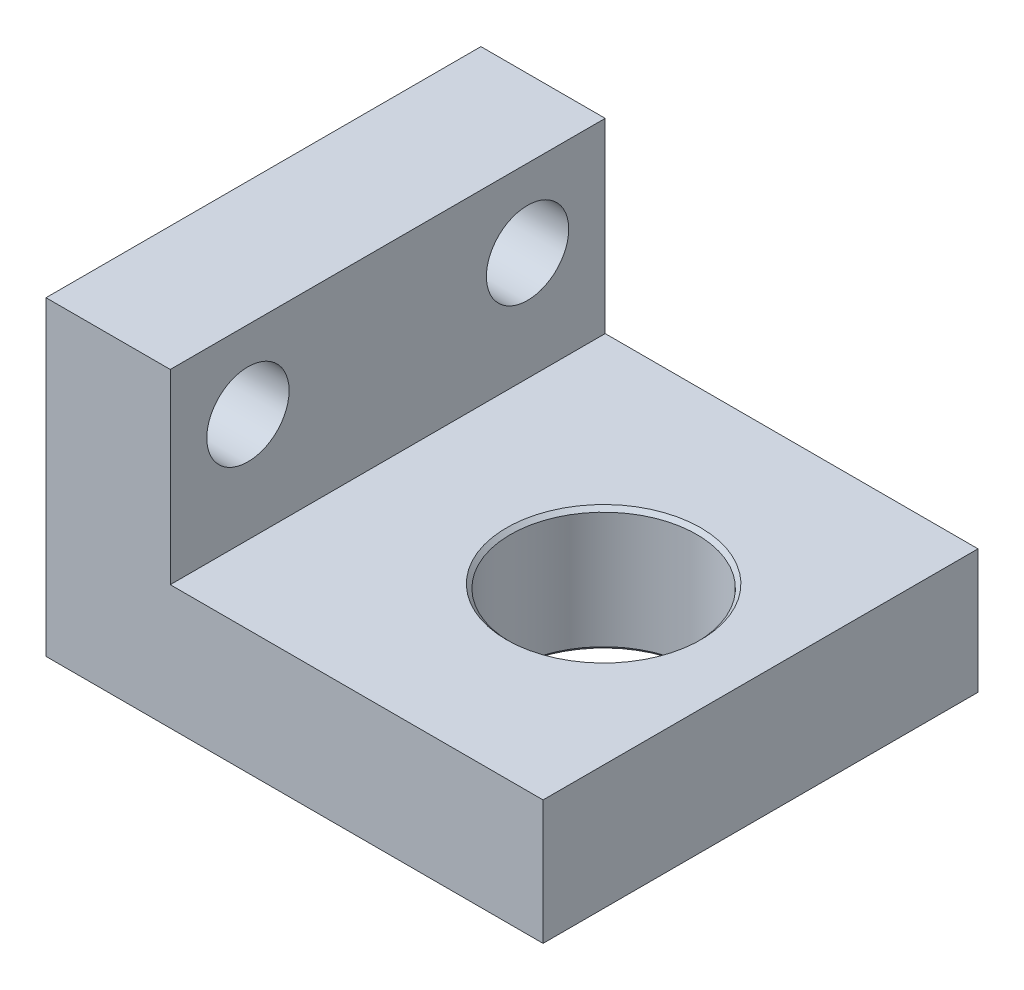
ISO-10303-21;
HEADER;
FILE_DESCRIPTION(('STEP AP214'),'2;1');
FILE_NAME('part.step','',(''),(''),'','','');
FILE_SCHEMA(('AUTOMOTIVE_DESIGN { 1 0 10303 214 1 1 1 1 }'));
ENDSEC;
DATA;
#1=APPLICATION_CONTEXT('core data for automotive mechanical design processes');
#2=APPLICATION_PROTOCOL_DEFINITION('international standard','automotive_design',2000,#1);
#3=PRODUCT_CONTEXT('',#1,'mechanical');
#4=PRODUCT('Part','Part','',(#3));
#5=PRODUCT_RELATED_PRODUCT_CATEGORY('part','',(#4));
#6=PRODUCT_DEFINITION_FORMATION('','',#4);
#7=PRODUCT_DEFINITION_CONTEXT('part definition',#1,'design');
#8=PRODUCT_DEFINITION('design','',#6,#7);
#9=PRODUCT_DEFINITION_SHAPE('','',#8);
#10=(LENGTH_UNIT() NAMED_UNIT(*) SI_UNIT(.MILLI.,.METRE.));
#11=(NAMED_UNIT(*) PLANE_ANGLE_UNIT() SI_UNIT($,.RADIAN.));
#12=(NAMED_UNIT(*) SI_UNIT($,.STERADIAN.) SOLID_ANGLE_UNIT());
#13=UNCERTAINTY_MEASURE_WITH_UNIT(LENGTH_MEASURE(1.E-05),#10,'distance_accuracy_value','');
#14=(GEOMETRIC_REPRESENTATION_CONTEXT(3) GLOBAL_UNCERTAINTY_ASSIGNED_CONTEXT((#13)) GLOBAL_UNIT_ASSIGNED_CONTEXT((#10,
#11,#12)) REPRESENTATION_CONTEXT('',''));
#15=CARTESIAN_POINT('',(0.,0.,0.));
#16=DIRECTION('',(0.,0.,1.));
#17=DIRECTION('',(1.,0.,0.));
#18=AXIS2_PLACEMENT_3D('',#15,#16,#17);
#19=CARTESIAN_POINT('',(-21.9,8.,14.));
#20=DIRECTION('',(1.,0.,0.));
#21=DIRECTION('',(0.,0.,-1.));
#22=AXIS2_PLACEMENT_3D('',#19,#20,#21);
#23=PLANE('',#22);
#24=CARTESIAN_POINT('',(-21.9,15.,9.00000000000001));
#25=DIRECTION('',(1.,0.,0.));
#26=DIRECTION('',(0.,0.,-1.));
#27=AXIS2_PLACEMENT_3D('',#24,#25,#26);
#28=CIRCLE('',#27,2.65);
#29=CARTESIAN_POINT('',(-21.9,15.,6.35));
#30=VERTEX_POINT('',#29);
#31=EDGE_CURVE('E168',#30,#30,#28,.T.);
#32=ORIENTED_EDGE('',*,*,#31,.T.);
#33=EDGE_LOOP('',(#32));
#34=FACE_BOUND('',#33,.T.);
#35=CARTESIAN_POINT('',(-21.9,15.,-8.99999999999999));
#36=DIRECTION('',(1.,0.,0.));
#37=DIRECTION('',(0.,0.,-1.));
#38=AXIS2_PLACEMENT_3D('',#35,#36,#37);
#39=CIRCLE('',#38,2.65);
#40=CARTESIAN_POINT('',(-21.9,15.,-11.65));
#41=VERTEX_POINT('',#40);
#42=EDGE_CURVE('E114',#41,#41,#39,.T.);
#43=ORIENTED_EDGE('',*,*,#42,.T.);
#44=EDGE_LOOP('',(#43));
#45=FACE_BOUND('',#44,.T.);
#46=DIRECTION('',(0.,0.,1.));
#47=VECTOR('',#46,1.);
#48=CARTESIAN_POINT('',(-21.9,0.,14.));
#49=LINE('',#48,#47);
#50=CARTESIAN_POINT('',(-21.9,0.,-14.));
#51=VERTEX_POINT('',#50);
#52=CARTESIAN_POINT('',(-21.9,0.,14.));
#53=VERTEX_POINT('',#52);
#54=EDGE_CURVE('E129',#51,#53,#49,.T.);
#55=ORIENTED_EDGE('',*,*,#54,.T.);
#56=DIRECTION('',(0.,-1.,0.));
#57=VECTOR('',#56,1.);
#58=CARTESIAN_POINT('',(-21.9,8.,14.));
#59=LINE('',#58,#57);
#60=CARTESIAN_POINT('',(-21.9,20.,14.));
#61=VERTEX_POINT('',#60);
#62=EDGE_CURVE('E11',#61,#53,#59,.T.);
#63=ORIENTED_EDGE('',*,*,#62,.F.);
#64=DIRECTION('',(0.,0.,-1.));
#65=VECTOR('',#64,1.);
#66=CARTESIAN_POINT('',(-21.9,20.,-14.));
#67=LINE('',#66,#65);
#68=CARTESIAN_POINT('',(-21.9,20.,-14.));
#69=VERTEX_POINT('',#68);
#70=EDGE_CURVE('E104',#61,#69,#67,.T.);
#71=ORIENTED_EDGE('',*,*,#70,.T.);
#72=DIRECTION('',(0.,-1.,0.));
#73=VECTOR('',#72,1.);
#74=CARTESIAN_POINT('',(-21.9,8.,-14.));
#75=LINE('',#74,#73);
#76=EDGE_CURVE('E135',#69,#51,#75,.T.);
#77=ORIENTED_EDGE('',*,*,#76,.T.);
#78=EDGE_LOOP('',(#55,#63,#71,#77));
#79=FACE_BOUND('',#78,.T.);
#80=ADVANCED_FACE('F37',(#34,#45,#79),#23,.F.);
#81=CARTESIAN_POINT('',(10.1,8.,14.));
#82=DIRECTION('',(0.,0.,-1.));
#83=DIRECTION('',(-1.,0.,0.));
#84=AXIS2_PLACEMENT_3D('',#81,#82,#83);
#85=PLANE('',#84);
#86=DIRECTION('',(1.,0.,0.));
#87=VECTOR('',#86,1.);
#88=CARTESIAN_POINT('',(10.1,8.,14.));
#89=LINE('',#88,#87);
#90=CARTESIAN_POINT('',(-13.9,8.,14.));
#91=VERTEX_POINT('',#90);
#92=CARTESIAN_POINT('',(10.1,8.,14.));
#93=VERTEX_POINT('',#92);
#94=EDGE_CURVE('E93',#91,#93,#89,.T.);
#95=ORIENTED_EDGE('',*,*,#94,.F.);
#96=DIRECTION('',(0.,1.,0.));
#97=VECTOR('',#96,1.);
#98=CARTESIAN_POINT('',(-13.9,0.,14.));
#99=LINE('',#98,#97);
#100=CARTESIAN_POINT('',(-13.9,20.,14.));
#101=VERTEX_POINT('',#100);
#102=EDGE_CURVE('E87',#91,#101,#99,.T.);
#103=ORIENTED_EDGE('',*,*,#102,.T.);
#104=DIRECTION('',(-1.,0.,0.));
#105=VECTOR('',#104,1.);
#106=CARTESIAN_POINT('',(-13.9,20.,14.));
#107=LINE('',#106,#105);
#108=EDGE_CURVE('E90',#101,#61,#107,.T.);
#109=ORIENTED_EDGE('',*,*,#108,.T.);
#110=ORIENTED_EDGE('',*,*,#62,.T.);
#111=DIRECTION('',(1.,0.,0.));
#112=VECTOR('',#111,1.);
#113=CARTESIAN_POINT('',(10.1,0.,14.));
#114=LINE('',#113,#112);
#115=CARTESIAN_POINT('',(10.1,0.,14.));
#116=VERTEX_POINT('',#115);
#117=EDGE_CURVE('E138',#53,#116,#114,.T.);
#118=ORIENTED_EDGE('',*,*,#117,.T.);
#119=DIRECTION('',(0.,-1.,0.));
#120=VECTOR('',#119,1.);
#121=CARTESIAN_POINT('',(10.1,8.,14.));
#122=LINE('',#121,#120);
#123=EDGE_CURVE('E44',#93,#116,#122,.T.);
#124=ORIENTED_EDGE('',*,*,#123,.F.);
#125=EDGE_LOOP('',(#95,#103,#109,#110,#118,#124));
#126=FACE_BOUND('',#125,.T.);
#127=ADVANCED_FACE('F89',(#126),#85,.F.);
#128=CARTESIAN_POINT('',(10.1,8.,14.));
#129=DIRECTION('',(-1.,0.,0.));
#130=DIRECTION('',(0.,0.,1.));
#131=AXIS2_PLACEMENT_3D('',#128,#129,#130);
#132=PLANE('',#131);
#133=DIRECTION('',(0.,0.,-1.));
#134=VECTOR('',#133,1.);
#135=CARTESIAN_POINT('',(10.1,0.,14.));
#136=LINE('',#135,#134);
#137=CARTESIAN_POINT('',(10.1,0.,-14.));
#138=VERTEX_POINT('',#137);
#139=EDGE_CURVE('E140',#116,#138,#136,.T.);
#140=ORIENTED_EDGE('',*,*,#139,.T.);
#141=DIRECTION('',(0.,-1.,0.));
#142=VECTOR('',#141,1.);
#143=CARTESIAN_POINT('',(10.1,8.,-14.));
#144=LINE('',#143,#142);
#145=CARTESIAN_POINT('',(10.1,8.,-14.));
#146=VERTEX_POINT('',#145);
#147=EDGE_CURVE('E145',#146,#138,#144,.T.);
#148=ORIENTED_EDGE('',*,*,#147,.F.);
#149=DIRECTION('',(0.,0.,-1.));
#150=VECTOR('',#149,1.);
#151=CARTESIAN_POINT('',(10.1,8.,14.));
#152=LINE('',#151,#150);
#153=EDGE_CURVE('E131',#93,#146,#152,.T.);
#154=ORIENTED_EDGE('',*,*,#153,.F.);
#155=ORIENTED_EDGE('',*,*,#123,.T.);
#156=EDGE_LOOP('',(#140,#148,#154,#155));
#157=FACE_BOUND('',#156,.T.);
#158=ADVANCED_FACE('F151',(#157),#132,.F.);
#159=CARTESIAN_POINT('',(10.1,8.,-14.));
#160=DIRECTION('',(0.,0.,1.));
#161=DIRECTION('',(1.,0.,0.));
#162=AXIS2_PLACEMENT_3D('',#159,#160,#161);
#163=PLANE('',#162);
#164=DIRECTION('',(-1.,0.,0.));
#165=VECTOR('',#164,1.);
#166=CARTESIAN_POINT('',(10.1,0.,-14.));
#167=LINE('',#166,#165);
#168=EDGE_CURVE('E132',#138,#51,#167,.T.);
#169=ORIENTED_EDGE('',*,*,#168,.T.);
#170=ORIENTED_EDGE('',*,*,#76,.F.);
#171=DIRECTION('',(-1.,0.,0.));
#172=VECTOR('',#171,1.);
#173=CARTESIAN_POINT('',(-13.9,20.,-14.));
#174=LINE('',#173,#172);
#175=CARTESIAN_POINT('',(-13.9,20.,-14.));
#176=VERTEX_POINT('',#175);
#177=EDGE_CURVE('E105',#176,#69,#174,.T.);
#178=ORIENTED_EDGE('',*,*,#177,.F.);
#179=DIRECTION('',(0.,-1.,0.));
#180=VECTOR('',#179,1.);
#181=CARTESIAN_POINT('',(-13.9,0.,-14.));
#182=LINE('',#181,#180);
#183=CARTESIAN_POINT('',(-13.9,8.,-14.));
#184=VERTEX_POINT('',#183);
#185=EDGE_CURVE('E97',#176,#184,#182,.T.);
#186=ORIENTED_EDGE('',*,*,#185,.T.);
#187=DIRECTION('',(-1.,0.,0.));
#188=VECTOR('',#187,1.);
#189=CARTESIAN_POINT('',(10.1,8.,-14.));
#190=LINE('',#189,#188);
#191=EDGE_CURVE('E51',#146,#184,#190,.T.);
#192=ORIENTED_EDGE('',*,*,#191,.F.);
#193=ORIENTED_EDGE('',*,*,#147,.T.);
#194=EDGE_LOOP('',(#169,#170,#178,#186,#192,#193));
#195=FACE_BOUND('',#194,.T.);
#196=ADVANCED_FACE('F158',(#195),#163,.F.);
#197=CARTESIAN_POINT('',(0.,8.,0.));
#198=DIRECTION('',(0.,1.,0.));
#199=DIRECTION('',(0.,0.,1.));
#200=AXIS2_PLACEMENT_3D('',#197,#198,#199);
#201=PLANE('',#200);
#202=DIRECTION('',(0.,0.,-1.));
#203=VECTOR('',#202,1.);
#204=CARTESIAN_POINT('',(-13.9,8.,0.));
#205=LINE('',#204,#203);
#206=EDGE_CURVE('E55',#91,#184,#205,.T.);
#207=ORIENTED_EDGE('',*,*,#206,.F.);
#208=ORIENTED_EDGE('',*,*,#94,.T.);
#209=ORIENTED_EDGE('',*,*,#153,.T.);
#210=ORIENTED_EDGE('',*,*,#191,.T.);
#211=EDGE_LOOP('',(#207,#208,#209,#210));
#212=FACE_BOUND('',#211,.T.);
#213=CARTESIAN_POINT('',(0.,8.,0.));
#214=DIRECTION('',(0.,1.,0.));
#215=DIRECTION('',(0.,0.,1.));
#216=AXIS2_PLACEMENT_3D('',#213,#214,#215);
#217=CIRCLE('',#216,6.25);
#218=CARTESIAN_POINT('',(0.,8.,6.25));
#219=VERTEX_POINT('',#218);
#220=EDGE_CURVE('E120',#219,#219,#217,.T.);
#221=ORIENTED_EDGE('',*,*,#220,.F.);
#222=EDGE_LOOP('',(#221));
#223=FACE_BOUND('',#222,.T.);
#224=ADVANCED_FACE('F212',(#212,#223),#201,.T.);
#225=CARTESIAN_POINT('',(0.,0.,0.));
#226=DIRECTION('',(0.,1.,0.));
#227=DIRECTION('',(0.,0.,1.));
#228=AXIS2_PLACEMENT_3D('',#225,#226,#227);
#229=PLANE('',#228);
#230=CARTESIAN_POINT('',(0.,0.,0.));
#231=DIRECTION('',(0.,1.,0.));
#232=DIRECTION('',(0.,0.,1.));
#233=AXIS2_PLACEMENT_3D('',#230,#231,#232);
#234=CIRCLE('',#233,6.25);
#235=CARTESIAN_POINT('',(0.,0.,6.25));
#236=VERTEX_POINT('',#235);
#237=EDGE_CURVE('E117',#236,#236,#234,.T.);
#238=ORIENTED_EDGE('',*,*,#237,.T.);
#239=EDGE_LOOP('',(#238));
#240=FACE_BOUND('',#239,.T.);
#241=ORIENTED_EDGE('',*,*,#139,.F.);
#242=ORIENTED_EDGE('',*,*,#117,.F.);
#243=ORIENTED_EDGE('',*,*,#54,.F.);
#244=ORIENTED_EDGE('',*,*,#168,.F.);
#245=EDGE_LOOP('',(#241,#242,#243,#244));
#246=FACE_BOUND('',#245,.T.);
#247=ADVANCED_FACE('F155',(#240,#246),#229,.F.);
#248=CARTESIAN_POINT('',(0.,0.250000000000002,0.));
#249=DIRECTION('',(0.,-1.,0.));
#250=DIRECTION('',(0.,0.,-1.));
#251=AXIS2_PLACEMENT_3D('',#248,#249,#250);
#252=CONICAL_SURFACE('',#251,6.,0.785398163397445);
#253=ORIENTED_EDGE('',*,*,#237,.F.);
#254=EDGE_LOOP('',(#253));
#255=FACE_BOUND('',#254,.T.);
#256=CARTESIAN_POINT('',(0.,0.250000000000002,0.));
#257=DIRECTION('',(0.,1.,0.));
#258=DIRECTION('',(0.,0.,1.));
#259=AXIS2_PLACEMENT_3D('',#256,#257,#258);
#260=CIRCLE('',#259,6.);
#261=CARTESIAN_POINT('',(0.,0.250000000000002,6.));
#262=VERTEX_POINT('',#261);
#263=EDGE_CURVE('E126',#262,#262,#260,.T.);
#264=ORIENTED_EDGE('',*,*,#263,.T.);
#265=EDGE_LOOP('',(#264));
#266=FACE_BOUND('',#265,.T.);
#267=ADVANCED_FACE('F207',(#255,#266),#252,.F.);
#268=CARTESIAN_POINT('',(0.,8.,0.));
#269=DIRECTION('',(0.,1.,0.));
#270=DIRECTION('',(0.,0.,1.));
#271=AXIS2_PLACEMENT_3D('',#268,#269,#270);
#272=CYLINDRICAL_SURFACE('',#271,6.);
#273=ORIENTED_EDGE('',*,*,#263,.F.);
#274=EDGE_LOOP('',(#273));
#275=FACE_BOUND('',#274,.T.);
#276=CARTESIAN_POINT('',(0.,7.75,0.));
#277=DIRECTION('',(0.,1.,0.));
#278=DIRECTION('',(0.,0.,1.));
#279=AXIS2_PLACEMENT_3D('',#276,#277,#278);
#280=CIRCLE('',#279,6.);
#281=CARTESIAN_POINT('',(0.,7.75,6.));
#282=VERTEX_POINT('',#281);
#283=EDGE_CURVE('E123',#282,#282,#280,.T.);
#284=ORIENTED_EDGE('',*,*,#283,.T.);
#285=EDGE_LOOP('',(#284));
#286=FACE_BOUND('',#285,.T.);
#287=ADVANCED_FACE('F203',(#275,#286),#272,.F.);
#288=CARTESIAN_POINT('',(0.,8.,0.));
#289=DIRECTION('',(0.,1.,0.));
#290=DIRECTION('',(0.,0.,1.));
#291=AXIS2_PLACEMENT_3D('',#288,#289,#290);
#292=CONICAL_SURFACE('',#291,6.25,0.785398163397457);
#293=ORIENTED_EDGE('',*,*,#283,.F.);
#294=EDGE_LOOP('',(#293));
#295=FACE_BOUND('',#294,.T.);
#296=ORIENTED_EDGE('',*,*,#220,.T.);
#297=EDGE_LOOP('',(#296));
#298=FACE_BOUND('',#297,.T.);
#299=ADVANCED_FACE('F200',(#295,#298),#292,.F.);
#300=CARTESIAN_POINT('',(-13.9,20.,-14.));
#301=DIRECTION('',(0.,1.,0.));
#302=DIRECTION('',(0.,0.,1.));
#303=AXIS2_PLACEMENT_3D('',#300,#301,#302);
#304=PLANE('',#303);
#305=ORIENTED_EDGE('',*,*,#70,.F.);
#306=ORIENTED_EDGE('',*,*,#108,.F.);
#307=DIRECTION('',(0.,0.,-1.));
#308=VECTOR('',#307,1.);
#309=CARTESIAN_POINT('',(-13.9,20.,-14.));
#310=LINE('',#309,#308);
#311=EDGE_CURVE('E96',#101,#176,#310,.T.);
#312=ORIENTED_EDGE('',*,*,#311,.T.);
#313=ORIENTED_EDGE('',*,*,#177,.T.);
#314=EDGE_LOOP('',(#305,#306,#312,#313));
#315=FACE_BOUND('',#314,.T.);
#316=ADVANCED_FACE('F101',(#315),#304,.T.);
#317=CARTESIAN_POINT('',(-13.9,0.,0.));
#318=DIRECTION('',(1.,0.,0.));
#319=DIRECTION('',(0.,0.,-1.));
#320=AXIS2_PLACEMENT_3D('',#317,#318,#319);
#321=PLANE('',#320);
#322=CARTESIAN_POINT('',(-13.9,15.,9.));
#323=DIRECTION('',(1.,0.,0.));
#324=DIRECTION('',(0.,0.,-1.));
#325=AXIS2_PLACEMENT_3D('',#322,#323,#324);
#326=CIRCLE('',#325,2.64999999999999);
#327=CARTESIAN_POINT('',(-13.9,15.,6.35000000000002));
#328=VERTEX_POINT('',#327);
#329=EDGE_CURVE('E178',#328,#328,#326,.T.);
#330=ORIENTED_EDGE('',*,*,#329,.F.);
#331=EDGE_LOOP('',(#330));
#332=FACE_BOUND('',#331,.T.);
#333=CARTESIAN_POINT('',(-13.9,15.,-9.));
#334=DIRECTION('',(1.,0.,0.));
#335=DIRECTION('',(0.,0.,-1.));
#336=AXIS2_PLACEMENT_3D('',#333,#334,#335);
#337=CIRCLE('',#336,2.64999999999999);
#338=CARTESIAN_POINT('',(-13.9,15.,-11.65));
#339=VERTEX_POINT('',#338);
#340=EDGE_CURVE('E172',#339,#339,#337,.T.);
#341=ORIENTED_EDGE('',*,*,#340,.F.);
#342=EDGE_LOOP('',(#341));
#343=FACE_BOUND('',#342,.T.);
#344=ORIENTED_EDGE('',*,*,#102,.F.);
#345=ORIENTED_EDGE('',*,*,#206,.T.);
#346=ORIENTED_EDGE('',*,*,#185,.F.);
#347=ORIENTED_EDGE('',*,*,#311,.F.);
#348=EDGE_LOOP('',(#344,#345,#346,#347));
#349=FACE_BOUND('',#348,.T.);
#350=ADVANCED_FACE('F108',(#332,#343,#349),#321,.T.);
#351=CARTESIAN_POINT('',(-13.9,15.,-9.));
#352=DIRECTION('',(1.,0.,0.));
#353=DIRECTION('',(0.,0.,-1.));
#354=AXIS2_PLACEMENT_3D('',#351,#352,#353);
#355=CYLINDRICAL_SURFACE('',#354,2.64999999999999);
#356=ORIENTED_EDGE('',*,*,#42,.F.);
#357=EDGE_LOOP('',(#356));
#358=FACE_BOUND('',#357,.T.);
#359=ORIENTED_EDGE('',*,*,#340,.T.);
#360=EDGE_LOOP('',(#359));
#361=FACE_BOUND('',#360,.T.);
#362=ADVANCED_FACE('F186',(#358,#361),#355,.F.);
#363=CARTESIAN_POINT('',(-13.9,15.,9.));
#364=DIRECTION('',(1.,0.,0.));
#365=DIRECTION('',(0.,0.,-1.));
#366=AXIS2_PLACEMENT_3D('',#363,#364,#365);
#367=CYLINDRICAL_SURFACE('',#366,2.64999999999999);
#368=ORIENTED_EDGE('',*,*,#31,.F.);
#369=EDGE_LOOP('',(#368));
#370=FACE_BOUND('',#369,.T.);
#371=ORIENTED_EDGE('',*,*,#329,.T.);
#372=EDGE_LOOP('',(#371));
#373=FACE_BOUND('',#372,.T.);
#374=ADVANCED_FACE('F182',(#370,#373),#367,.F.);
#375=CLOSED_SHELL('',(#80,#127,#158,#196,#224,#247,#267,#287,#299,#316,#350,#362,#374));
#376=MANIFOLD_SOLID_BREP('B2',#375);
#377=ADVANCED_BREP_SHAPE_REPRESENTATION('',(#18,#376),#14);
#378=SHAPE_DEFINITION_REPRESENTATION(#9,#377);
ENDSEC;
END-ISO-10303-21;
